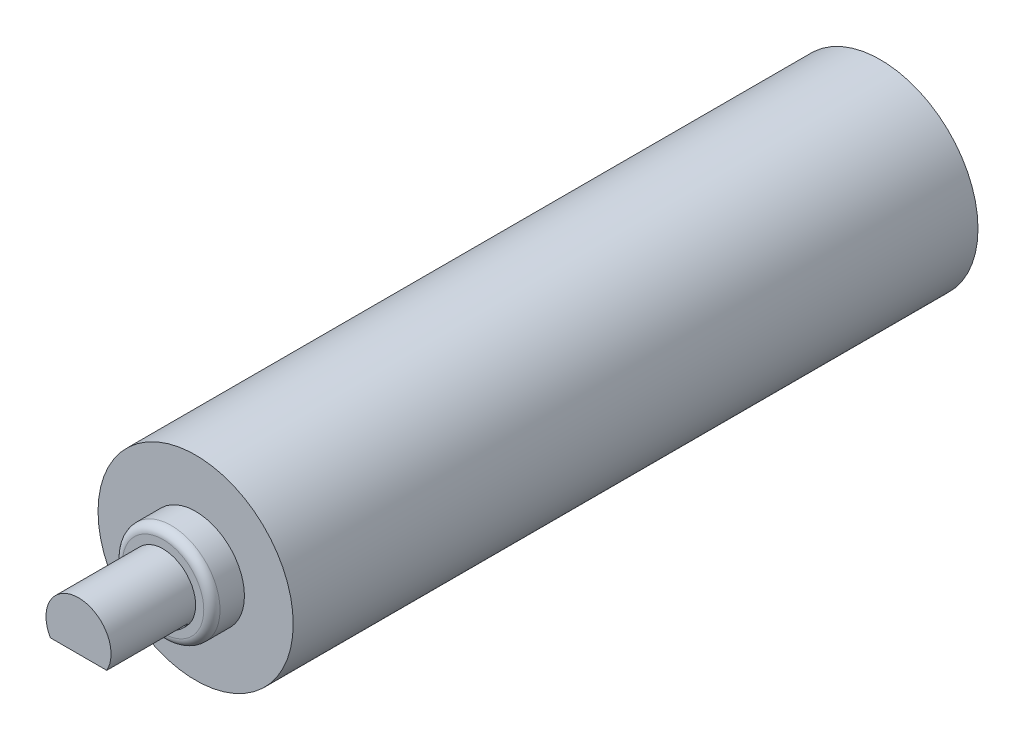
ISO-10303-21;
HEADER;
FILE_DESCRIPTION(('STEP AP214'),'2;1');
FILE_NAME('part.step','',(''),(''),'','','');
FILE_SCHEMA(('AUTOMOTIVE_DESIGN { 1 0 10303 214 1 1 1 1 }'));
ENDSEC;
DATA;
#1=APPLICATION_CONTEXT('core data for automotive mechanical design processes');
#2=APPLICATION_PROTOCOL_DEFINITION('international standard','automotive_design',2000,#1);
#3=PRODUCT_CONTEXT('',#1,'mechanical');
#4=PRODUCT('Part','Part','',(#3));
#5=PRODUCT_RELATED_PRODUCT_CATEGORY('part','',(#4));
#6=PRODUCT_DEFINITION_FORMATION('','',#4);
#7=PRODUCT_DEFINITION_CONTEXT('part definition',#1,'design');
#8=PRODUCT_DEFINITION('design','',#6,#7);
#9=PRODUCT_DEFINITION_SHAPE('','',#8);
#10=(LENGTH_UNIT() NAMED_UNIT(*) SI_UNIT(.MILLI.,.METRE.));
#11=(NAMED_UNIT(*) PLANE_ANGLE_UNIT() SI_UNIT($,.RADIAN.));
#12=(NAMED_UNIT(*) SI_UNIT($,.STERADIAN.) SOLID_ANGLE_UNIT());
#13=UNCERTAINTY_MEASURE_WITH_UNIT(LENGTH_MEASURE(1.E-05),#10,'distance_accuracy_value','');
#14=(GEOMETRIC_REPRESENTATION_CONTEXT(3) GLOBAL_UNCERTAINTY_ASSIGNED_CONTEXT((#13)) GLOBAL_UNIT_ASSIGNED_CONTEXT((#10,
#11,#12)) REPRESENTATION_CONTEXT('',''));
#15=CARTESIAN_POINT('',(0.,0.,0.));
#16=DIRECTION('',(0.,0.,1.));
#17=DIRECTION('',(1.,0.,0.));
#18=AXIS2_PLACEMENT_3D('',#15,#16,#17);
#19=CARTESIAN_POINT('',(0.,0.,-21.05));
#20=DIRECTION('',(0.,0.,1.));
#21=DIRECTION('',(1.,0.,0.));
#22=AXIS2_PLACEMENT_3D('',#19,#20,#21);
#23=CYLINDRICAL_SURFACE('',#22,3.);
#24=CARTESIAN_POINT('',(0.,0.,-21.05));
#25=DIRECTION('',(0.,0.,1.));
#26=DIRECTION('',(1.,0.,0.));
#27=AXIS2_PLACEMENT_3D('',#24,#25,#26);
#28=CIRCLE('',#27,3.);
#29=CARTESIAN_POINT('',(3.,0.,-21.05));
#30=VERTEX_POINT('',#29);
#31=EDGE_CURVE('E100',#30,#30,#28,.T.);
#32=ORIENTED_EDGE('',*,*,#31,.T.);
#33=EDGE_LOOP('',(#32));
#34=FACE_BOUND('',#33,.T.);
#35=CARTESIAN_POINT('',(0.,0.,0.));
#36=DIRECTION('',(0.,0.,1.));
#37=DIRECTION('',(1.,0.,0.));
#38=AXIS2_PLACEMENT_3D('',#35,#36,#37);
#39=CIRCLE('',#38,3.);
#40=CARTESIAN_POINT('',(3.,0.,0.));
#41=VERTEX_POINT('',#40);
#42=EDGE_CURVE('E93',#41,#41,#39,.T.);
#43=ORIENTED_EDGE('',*,*,#42,.F.);
#44=EDGE_LOOP('',(#43));
#45=FACE_BOUND('',#44,.T.);
#46=ADVANCED_FACE('F34',(#34,#45),#23,.T.);
#47=CARTESIAN_POINT('',(0.,0.,-21.05));
#48=DIRECTION('',(0.,0.,1.));
#49=DIRECTION('',(1.,0.,0.));
#50=AXIS2_PLACEMENT_3D('',#47,#48,#49);
#51=PLANE('',#50);
#52=ORIENTED_EDGE('',*,*,#31,.F.);
#53=EDGE_LOOP('',(#52));
#54=FACE_BOUND('',#53,.T.);
#55=ADVANCED_FACE('F120',(#54),#51,.F.);
#56=CARTESIAN_POINT('',(0.,0.,0.));
#57=DIRECTION('',(0.,0.,1.));
#58=DIRECTION('',(1.,0.,0.));
#59=AXIS2_PLACEMENT_3D('',#56,#57,#58);
#60=PLANE('',#59);
#61=CARTESIAN_POINT('',(0.,0.,0.));
#62=DIRECTION('',(0.,0.,1.));
#63=DIRECTION('',(1.,0.,0.));
#64=AXIS2_PLACEMENT_3D('',#61,#62,#63);
#65=CIRCLE('',#64,1.5);
#66=CARTESIAN_POINT('',(1.5,0.,0.));
#67=VERTEX_POINT('',#66);
#68=EDGE_CURVE('E97',#67,#67,#65,.T.);
#69=ORIENTED_EDGE('',*,*,#68,.F.);
#70=EDGE_LOOP('',(#69));
#71=FACE_BOUND('',#70,.T.);
#72=ORIENTED_EDGE('',*,*,#42,.T.);
#73=EDGE_LOOP('',(#72));
#74=FACE_BOUND('',#73,.T.);
#75=ADVANCED_FACE('F125',(#71,#74),#60,.T.);
#76=CARTESIAN_POINT('',(0.,0.,1.));
#77=DIRECTION('',(0.,0.,-1.));
#78=DIRECTION('',(-1.,0.,0.));
#79=AXIS2_PLACEMENT_3D('',#76,#77,#78);
#80=CYLINDRICAL_SURFACE('',#79,1.5);
#81=CARTESIAN_POINT('',(0.,0.,0.75));
#82=DIRECTION('',(0.,0.,1.));
#83=DIRECTION('',(1.,0.,0.));
#84=AXIS2_PLACEMENT_3D('',#81,#82,#83);
#85=CIRCLE('',#84,1.5);
#86=CARTESIAN_POINT('',(1.5,0.,0.75));
#87=VERTEX_POINT('',#86);
#88=EDGE_CURVE('E11',#87,#87,#85,.F.);
#89=ORIENTED_EDGE('',*,*,#88,.T.);
#90=EDGE_LOOP('',(#89));
#91=FACE_BOUND('',#90,.T.);
#92=ORIENTED_EDGE('',*,*,#68,.T.);
#93=EDGE_LOOP('',(#92));
#94=FACE_BOUND('',#93,.T.);
#95=ADVANCED_FACE('F131',(#91,#94),#80,.T.);
#96=CARTESIAN_POINT('',(0.,0.,1.));
#97=DIRECTION('',(0.,0.,1.));
#98=DIRECTION('',(1.,0.,0.));
#99=AXIS2_PLACEMENT_3D('',#96,#97,#98);
#100=PLANE('',#99);
#101=CARTESIAN_POINT('',(0.,0.,1.));
#102=DIRECTION('',(0.,0.,1.));
#103=DIRECTION('',(1.,0.,0.));
#104=AXIS2_PLACEMENT_3D('',#101,#102,#103);
#105=CIRCLE('',#104,1.25);
#106=CARTESIAN_POINT('',(1.25,0.,1.));
#107=VERTEX_POINT('',#106);
#108=EDGE_CURVE('E42',#107,#107,#105,.T.);
#109=ORIENTED_EDGE('',*,*,#108,.T.);
#110=EDGE_LOOP('',(#109));
#111=FACE_BOUND('',#110,.T.);
#112=CARTESIAN_POINT('',(0.,0.,1.));
#113=DIRECTION('',(0.,0.,1.));
#114=DIRECTION('',(1.,0.,0.));
#115=AXIS2_PLACEMENT_3D('',#112,#113,#114);
#116=CIRCLE('',#115,1.);
#117=CARTESIAN_POINT('',(1.,0.,1.));
#118=VERTEX_POINT('',#117);
#119=EDGE_CURVE('E94',#118,#118,#116,.T.);
#120=ORIENTED_EDGE('',*,*,#119,.F.);
#121=EDGE_LOOP('',(#120));
#122=FACE_BOUND('',#121,.T.);
#123=ADVANCED_FACE('F109',(#111,#122),#100,.T.);
#124=CARTESIAN_POINT('',(0.,0.,3.6));
#125=DIRECTION('',(0.,0.,-1.));
#126=DIRECTION('',(-1.,0.,0.));
#127=AXIS2_PLACEMENT_3D('',#124,#125,#126);
#128=CYLINDRICAL_SURFACE('',#127,1.);
#129=CARTESIAN_POINT('',(0.,0.,1.1));
#130=DIRECTION('',(0.,0.,1.));
#131=DIRECTION('',(1.,0.,0.));
#132=AXIS2_PLACEMENT_3D('',#129,#130,#131);
#133=CIRCLE('',#132,1.);
#134=CARTESIAN_POINT('',(-0.866025403784439,-0.5,1.1));
#135=VERTEX_POINT('',#134);
#136=CARTESIAN_POINT('',(0.862464594948922,-0.50611739987832,1.1));
#137=VERTEX_POINT('',#136);
#138=EDGE_CURVE('E56',#135,#137,#133,.T.);
#139=ORIENTED_EDGE('',*,*,#138,.F.);
#140=DIRECTION('',(0.,0.,-1.));
#141=VECTOR('',#140,1.);
#142=CARTESIAN_POINT('',(-0.866025403784439,-0.5,3.6));
#143=LINE('',#142,#141);
#144=CARTESIAN_POINT('',(-0.866025403784438,-0.5,3.6));
#145=VERTEX_POINT('',#144);
#146=EDGE_CURVE('E80',#135,#145,#143,.F.);
#147=ORIENTED_EDGE('',*,*,#146,.T.);
#148=CARTESIAN_POINT('',(0.,0.,3.6));
#149=DIRECTION('',(0.,0.,1.));
#150=DIRECTION('',(1.,0.,0.));
#151=AXIS2_PLACEMENT_3D('',#148,#149,#150);
#152=CIRCLE('',#151,1.);
#153=CARTESIAN_POINT('',(0.862464594948922,-0.50611739987832,3.6));
#154=VERTEX_POINT('',#153);
#155=EDGE_CURVE('E90',#154,#145,#152,.T.);
#156=ORIENTED_EDGE('',*,*,#155,.F.);
#157=DIRECTION('',(0.,0.,-1.));
#158=VECTOR('',#157,1.);
#159=CARTESIAN_POINT('',(0.862464594948922,-0.50611739987832,3.6));
#160=LINE('',#159,#158);
#161=EDGE_CURVE('E49',#154,#137,#160,.T.);
#162=ORIENTED_EDGE('',*,*,#161,.T.);
#163=EDGE_LOOP('',(#139,#147,#156,#162));
#164=FACE_BOUND('',#163,.T.);
#165=ORIENTED_EDGE('',*,*,#119,.T.);
#166=EDGE_LOOP('',(#165));
#167=FACE_BOUND('',#166,.T.);
#168=ADVANCED_FACE('F139',(#164,#167),#128,.T.);
#169=CARTESIAN_POINT('',(0.,0.,3.6));
#170=DIRECTION('',(0.,0.,1.));
#171=DIRECTION('',(1.,0.,0.));
#172=AXIS2_PLACEMENT_3D('',#169,#170,#171);
#173=PLANE('',#172);
#174=DIRECTION('',(-1.,0.,0.));
#175=VECTOR('',#174,1.);
#176=CARTESIAN_POINT('',(0.,-0.5,3.6));
#177=LINE('',#176,#175);
#178=CARTESIAN_POINT('',(0.862464594948922,-0.5,3.6));
#179=VERTEX_POINT('',#178);
#180=EDGE_CURVE('E81',#179,#145,#177,.T.);
#181=ORIENTED_EDGE('',*,*,#180,.F.);
#182=DIRECTION('',(0.,1.,0.));
#183=VECTOR('',#182,1.);
#184=CARTESIAN_POINT('',(0.862464594948922,0.,3.6));
#185=LINE('',#184,#183);
#186=EDGE_CURVE('E84',#154,#179,#185,.T.);
#187=ORIENTED_EDGE('',*,*,#186,.F.);
#188=ORIENTED_EDGE('',*,*,#155,.T.);
#189=EDGE_LOOP('',(#181,#187,#188));
#190=FACE_BOUND('',#189,.T.);
#191=ADVANCED_FACE('F142',(#190),#173,.T.);
#192=CARTESIAN_POINT('',(0.,0.,1.1));
#193=DIRECTION('',(0.,0.,1.));
#194=DIRECTION('',(1.,0.,0.));
#195=AXIS2_PLACEMENT_3D('',#192,#193,#194);
#196=PLANE('',#195);
#197=DIRECTION('',(-1.,0.,0.));
#198=VECTOR('',#197,1.);
#199=CARTESIAN_POINT('',(0.,-0.5,1.1));
#200=LINE('',#199,#198);
#201=CARTESIAN_POINT('',(0.862464594948922,-0.5,1.1));
#202=VERTEX_POINT('',#201);
#203=EDGE_CURVE('E72',#202,#135,#200,.T.);
#204=ORIENTED_EDGE('',*,*,#203,.T.);
#205=ORIENTED_EDGE('',*,*,#138,.T.);
#206=DIRECTION('',(0.,1.,0.));
#207=VECTOR('',#206,1.);
#208=CARTESIAN_POINT('',(0.862464594948922,-0.5,1.1));
#209=LINE('',#208,#207);
#210=EDGE_CURVE('E69',#137,#202,#209,.T.);
#211=ORIENTED_EDGE('',*,*,#210,.T.);
#212=EDGE_LOOP('',(#204,#205,#211));
#213=FACE_BOUND('',#212,.T.);
#214=ADVANCED_FACE('F71',(#213),#196,.T.);
#215=CARTESIAN_POINT('',(0.,-0.5,1.1));
#216=DIRECTION('',(0.,1.,0.));
#217=DIRECTION('',(0.,0.,1.));
#218=AXIS2_PLACEMENT_3D('',#215,#216,#217);
#219=PLANE('',#218);
#220=ORIENTED_EDGE('',*,*,#203,.F.);
#221=DIRECTION('',(0.,0.,1.));
#222=VECTOR('',#221,1.);
#223=CARTESIAN_POINT('',(0.862464594948922,-0.5,1.1));
#224=LINE('',#223,#222);
#225=EDGE_CURVE('E74',#202,#179,#224,.T.);
#226=ORIENTED_EDGE('',*,*,#225,.T.);
#227=ORIENTED_EDGE('',*,*,#180,.T.);
#228=ORIENTED_EDGE('',*,*,#146,.F.);
#229=EDGE_LOOP('',(#220,#226,#227,#228));
#230=FACE_BOUND('',#229,.T.);
#231=ADVANCED_FACE('F78',(#230),#219,.F.);
#232=CARTESIAN_POINT('',(0.862464594948922,-0.5,1.1));
#233=DIRECTION('',(1.,0.,0.));
#234=DIRECTION('',(0.,0.,-1.));
#235=AXIS2_PLACEMENT_3D('',#232,#233,#234);
#236=PLANE('',#235);
#237=ORIENTED_EDGE('',*,*,#186,.T.);
#238=ORIENTED_EDGE('',*,*,#225,.F.);
#239=ORIENTED_EDGE('',*,*,#210,.F.);
#240=ORIENTED_EDGE('',*,*,#161,.F.);
#241=EDGE_LOOP('',(#237,#238,#239,#240));
#242=FACE_BOUND('',#241,.T.);
#243=ADVANCED_FACE('F83',(#242),#236,.F.);
#244=CARTESIAN_POINT('',(0.,0.,0.75));
#245=DIRECTION('',(0.,0.,1.));
#246=DIRECTION('',(1.,0.,0.));
#247=AXIS2_PLACEMENT_3D('',#244,#245,#246);
#248=TOROIDAL_SURFACE('',#247,1.25,0.25);
#249=ORIENTED_EDGE('',*,*,#88,.F.);
#250=EDGE_LOOP('',(#249));
#251=FACE_BOUND('',#250,.T.);
#252=ORIENTED_EDGE('',*,*,#108,.F.);
#253=EDGE_LOOP('',(#252));
#254=FACE_BOUND('',#253,.T.);
#255=ADVANCED_FACE('F36',(#251,#254),#248,.T.);
#256=CLOSED_SHELL('',(#46,#55,#75,#95,#123,#168,#191,#214,#231,#243,#255));
#257=MANIFOLD_SOLID_BREP('B2',#256);
#258=ADVANCED_BREP_SHAPE_REPRESENTATION('',(#18,#257),#14);
#259=SHAPE_DEFINITION_REPRESENTATION(#9,#258);
ENDSEC;
END-ISO-10303-21;
